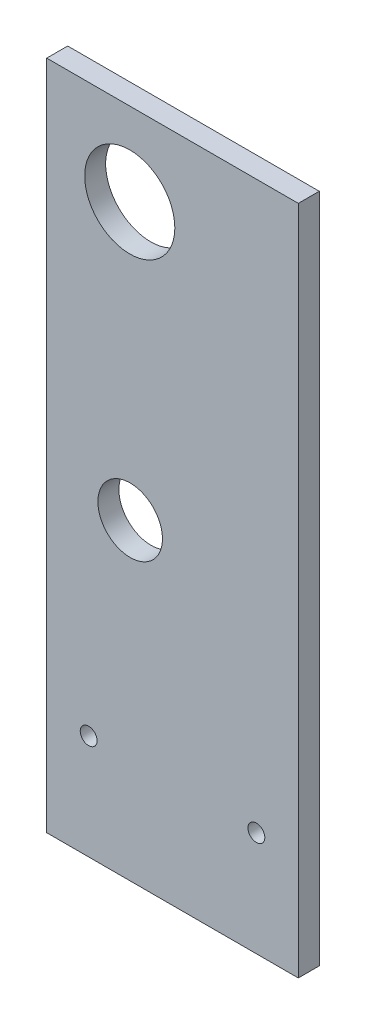
ISO-10303-21;
HEADER;
FILE_DESCRIPTION(('STEP AP214'),'2;1');
FILE_NAME('part.step','',(''),(''),'','','');
FILE_SCHEMA(('AUTOMOTIVE_DESIGN { 1 0 10303 214 1 1 1 1 }'));
ENDSEC;
DATA;
#1=APPLICATION_CONTEXT('core data for automotive mechanical design processes');
#2=APPLICATION_PROTOCOL_DEFINITION('international standard','automotive_design',2000,#1);
#3=PRODUCT_CONTEXT('',#1,'mechanical');
#4=PRODUCT('Part','Part','',(#3));
#5=PRODUCT_RELATED_PRODUCT_CATEGORY('part','',(#4));
#6=PRODUCT_DEFINITION_FORMATION('','',#4);
#7=PRODUCT_DEFINITION_CONTEXT('part definition',#1,'design');
#8=PRODUCT_DEFINITION('design','',#6,#7);
#9=PRODUCT_DEFINITION_SHAPE('','',#8);
#10=(LENGTH_UNIT() NAMED_UNIT(*) SI_UNIT(.MILLI.,.METRE.));
#11=(NAMED_UNIT(*) PLANE_ANGLE_UNIT() SI_UNIT($,.RADIAN.));
#12=(NAMED_UNIT(*) SI_UNIT($,.STERADIAN.) SOLID_ANGLE_UNIT());
#13=UNCERTAINTY_MEASURE_WITH_UNIT(LENGTH_MEASURE(1.E-05),#10,'distance_accuracy_value','');
#14=(GEOMETRIC_REPRESENTATION_CONTEXT(3) GLOBAL_UNCERTAINTY_ASSIGNED_CONTEXT((#13)) GLOBAL_UNIT_ASSIGNED_CONTEXT((#10,
#11,#12)) REPRESENTATION_CONTEXT('',''));
#15=CARTESIAN_POINT('',(0.,0.,0.));
#16=DIRECTION('',(0.,0.,1.));
#17=DIRECTION('',(1.,0.,0.));
#18=AXIS2_PLACEMENT_3D('',#15,#16,#17);
#19=CARTESIAN_POINT('',(-62.9053069719043,37.9942767950052,6.35));
#20=DIRECTION('',(1.,0.,0.));
#21=DIRECTION('',(0.,1.,0.));
#22=AXIS2_PLACEMENT_3D('',#19,#20,#21);
#23=PLANE('',#22);
#24=DIRECTION('',(0.,-1.,0.));
#25=VECTOR('',#24,1.);
#26=CARTESIAN_POINT('',(-62.9053069719043,37.9942767950052,0.));
#27=LINE('',#26,#25);
#28=CARTESIAN_POINT('',(-62.9053069719043,37.9942767950052,0.));
#29=VERTEX_POINT('',#28);
#30=CARTESIAN_POINT('',(-62.9053069719042,-165.205723204995,0.));
#31=VERTEX_POINT('',#30);
#32=EDGE_CURVE('E110',#29,#31,#27,.T.);
#33=ORIENTED_EDGE('',*,*,#32,.T.);
#34=DIRECTION('',(0.,0.,-1.));
#35=VECTOR('',#34,1.);
#36=CARTESIAN_POINT('',(-62.9053069719042,-165.205723204995,6.35));
#37=LINE('',#36,#35);
#38=CARTESIAN_POINT('',(-62.9053069719042,-165.205723204995,6.35));
#39=VERTEX_POINT('',#38);
#40=EDGE_CURVE('E11',#39,#31,#37,.T.);
#41=ORIENTED_EDGE('',*,*,#40,.F.);
#42=DIRECTION('',(0.,-1.,0.));
#43=VECTOR('',#42,1.);
#44=CARTESIAN_POINT('',(-62.9053069719043,37.9942767950052,6.35));
#45=LINE('',#44,#43);
#46=CARTESIAN_POINT('',(-62.9053069719043,37.9942767950052,6.35));
#47=VERTEX_POINT('',#46);
#48=EDGE_CURVE('E94',#47,#39,#45,.T.);
#49=ORIENTED_EDGE('',*,*,#48,.F.);
#50=DIRECTION('',(0.,0.,-1.));
#51=VECTOR('',#50,1.);
#52=CARTESIAN_POINT('',(-62.9053069719043,37.9942767950052,6.35));
#53=LINE('',#52,#51);
#54=EDGE_CURVE('E106',#47,#29,#53,.T.);
#55=ORIENTED_EDGE('',*,*,#54,.T.);
#56=EDGE_LOOP('',(#33,#41,#49,#55));
#57=FACE_BOUND('',#56,.T.);
#58=ADVANCED_FACE('F42',(#57),#23,.F.);
#59=CARTESIAN_POINT('',(-62.9053069719042,-165.205723204995,6.35));
#60=DIRECTION('',(0.,1.,0.));
#61=DIRECTION('',(0.,0.,1.));
#62=AXIS2_PLACEMENT_3D('',#59,#60,#61);
#63=PLANE('',#62);
#64=DIRECTION('',(1.,0.,0.));
#65=VECTOR('',#64,1.);
#66=CARTESIAN_POINT('',(-62.9053069719042,-165.205723204995,0.));
#67=LINE('',#66,#65);
#68=CARTESIAN_POINT('',(13.2946930280958,-165.205723204995,0.));
#69=VERTEX_POINT('',#68);
#70=EDGE_CURVE('E99',#31,#69,#67,.T.);
#71=ORIENTED_EDGE('',*,*,#70,.T.);
#72=DIRECTION('',(0.,0.,-1.));
#73=VECTOR('',#72,1.);
#74=CARTESIAN_POINT('',(13.2946930280958,-165.205723204995,6.35));
#75=LINE('',#74,#73);
#76=CARTESIAN_POINT('',(13.2946930280958,-165.205723204995,6.35));
#77=VERTEX_POINT('',#76);
#78=EDGE_CURVE('E51',#77,#69,#75,.T.);
#79=ORIENTED_EDGE('',*,*,#78,.F.);
#80=DIRECTION('',(1.,0.,0.));
#81=VECTOR('',#80,1.);
#82=CARTESIAN_POINT('',(-62.9053069719042,-165.205723204995,6.35));
#83=LINE('',#82,#81);
#84=EDGE_CURVE('E89',#39,#77,#83,.T.);
#85=ORIENTED_EDGE('',*,*,#84,.F.);
#86=ORIENTED_EDGE('',*,*,#40,.T.);
#87=EDGE_LOOP('',(#71,#79,#85,#86));
#88=FACE_BOUND('',#87,.T.);
#89=ADVANCED_FACE('F98',(#88),#63,.F.);
#90=CARTESIAN_POINT('',(13.2946930280957,37.9942767950052,6.35));
#91=DIRECTION('',(-1.,0.,0.));
#92=DIRECTION('',(0.,-1.,0.));
#93=AXIS2_PLACEMENT_3D('',#90,#91,#92);
#94=PLANE('',#93);
#95=DIRECTION('',(0.,1.,0.));
#96=VECTOR('',#95,1.);
#97=CARTESIAN_POINT('',(13.2946930280957,37.9942767950052,0.));
#98=LINE('',#97,#96);
#99=CARTESIAN_POINT('',(13.2946930280957,37.9942767950052,0.));
#100=VERTEX_POINT('',#99);
#101=EDGE_CURVE('E76',#69,#100,#98,.T.);
#102=ORIENTED_EDGE('',*,*,#101,.T.);
#103=DIRECTION('',(0.,0.,-1.));
#104=VECTOR('',#103,1.);
#105=CARTESIAN_POINT('',(13.2946930280957,37.9942767950052,6.35));
#106=LINE('',#105,#104);
#107=CARTESIAN_POINT('',(13.2946930280957,37.9942767950052,6.35));
#108=VERTEX_POINT('',#107);
#109=EDGE_CURVE('E101',#108,#100,#106,.T.);
#110=ORIENTED_EDGE('',*,*,#109,.F.);
#111=DIRECTION('',(0.,1.,0.));
#112=VECTOR('',#111,1.);
#113=CARTESIAN_POINT('',(13.2946930280957,37.9942767950052,6.35));
#114=LINE('',#113,#112);
#115=EDGE_CURVE('E92',#77,#108,#114,.T.);
#116=ORIENTED_EDGE('',*,*,#115,.F.);
#117=ORIENTED_EDGE('',*,*,#78,.T.);
#118=EDGE_LOOP('',(#102,#110,#116,#117));
#119=FACE_BOUND('',#118,.T.);
#120=ADVANCED_FACE('F102',(#119),#94,.F.);
#121=CARTESIAN_POINT('',(-62.9053069719043,37.9942767950052,6.35));
#122=DIRECTION('',(0.,-1.,0.));
#123=DIRECTION('',(0.,0.,-1.));
#124=AXIS2_PLACEMENT_3D('',#121,#122,#123);
#125=PLANE('',#124);
#126=DIRECTION('',(-1.,0.,0.));
#127=VECTOR('',#126,1.);
#128=CARTESIAN_POINT('',(-62.9053069719043,37.9942767950052,0.));
#129=LINE('',#128,#127);
#130=EDGE_CURVE('E82',#100,#29,#129,.T.);
#131=ORIENTED_EDGE('',*,*,#130,.T.);
#132=ORIENTED_EDGE('',*,*,#54,.F.);
#133=DIRECTION('',(-1.,0.,0.));
#134=VECTOR('',#133,1.);
#135=CARTESIAN_POINT('',(-62.9053069719043,37.9942767950052,6.35));
#136=LINE('',#135,#134);
#137=EDGE_CURVE('E59',#108,#47,#136,.T.);
#138=ORIENTED_EDGE('',*,*,#137,.F.);
#139=ORIENTED_EDGE('',*,*,#109,.T.);
#140=EDGE_LOOP('',(#131,#132,#138,#139));
#141=FACE_BOUND('',#140,.T.);
#142=ADVANCED_FACE('F124',(#141),#125,.F.);
#143=CARTESIAN_POINT('',(0.,0.,6.35));
#144=DIRECTION('',(0.,0.,1.));
#145=DIRECTION('',(1.,0.,0.));
#146=AXIS2_PLACEMENT_3D('',#143,#144,#145);
#147=PLANE('',#146);
#148=CARTESIAN_POINT('',(-37.7593069719043,12.8482767950053,6.35));
#149=DIRECTION('',(0.,0.,1.));
#150=DIRECTION('',(1.,0.,0.));
#151=AXIS2_PLACEMENT_3D('',#148,#149,#150);
#152=CIRCLE('',#151,13.6525);
#153=CARTESIAN_POINT('',(-24.1068069719043,12.8482767950053,6.35));
#154=VERTEX_POINT('',#153);
#155=EDGE_CURVE('E158',#154,#154,#152,.T.);
#156=ORIENTED_EDGE('',*,*,#155,.F.);
#157=EDGE_LOOP('',(#156));
#158=FACE_BOUND('',#157,.T.);
#159=CARTESIAN_POINT('',(-37.6323069719042,-70.5907232049947,6.34999999999999));
#160=DIRECTION('',(0.,0.,1.));
#161=DIRECTION('',(1.,0.,0.));
#162=AXIS2_PLACEMENT_3D('',#159,#160,#161);
#163=CIRCLE('',#162,9.77899999999999);
#164=CARTESIAN_POINT('',(-27.8533069719043,-70.5907232049947,6.34999999999999));
#165=VERTEX_POINT('',#164);
#166=EDGE_CURVE('E145',#165,#165,#163,.T.);
#167=ORIENTED_EDGE('',*,*,#166,.F.);
#168=EDGE_LOOP('',(#167));
#169=FACE_BOUND('',#168,.T.);
#170=CARTESIAN_POINT('',(-50.2053069719042,-133.455723204995,6.34999999999999));
#171=DIRECTION('',(0.,0.,1.));
#172=DIRECTION('',(1.,0.,0.));
#173=AXIS2_PLACEMENT_3D('',#170,#171,#172);
#174=CIRCLE('',#173,2.55270000000001);
#175=CARTESIAN_POINT('',(-47.6526069719042,-133.455723204995,6.34999999999999));
#176=VERTEX_POINT('',#175);
#177=EDGE_CURVE('E135',#176,#176,#174,.T.);
#178=ORIENTED_EDGE('',*,*,#177,.F.);
#179=EDGE_LOOP('',(#178));
#180=FACE_BOUND('',#179,.T.);
#181=CARTESIAN_POINT('',(0.594693028095776,-133.455723204995,6.34999999999999));
#182=DIRECTION('',(0.,0.,1.));
#183=DIRECTION('',(1.,0.,0.));
#184=AXIS2_PLACEMENT_3D('',#181,#182,#183);
#185=CIRCLE('',#184,2.5527);
#186=CARTESIAN_POINT('',(3.14739302809578,-133.455723204995,6.34999999999999));
#187=VERTEX_POINT('',#186);
#188=EDGE_CURVE('E136',#187,#187,#185,.T.);
#189=ORIENTED_EDGE('',*,*,#188,.F.);
#190=EDGE_LOOP('',(#189));
#191=FACE_BOUND('',#190,.T.);
#192=ORIENTED_EDGE('',*,*,#48,.T.);
#193=ORIENTED_EDGE('',*,*,#84,.T.);
#194=ORIENTED_EDGE('',*,*,#115,.T.);
#195=ORIENTED_EDGE('',*,*,#137,.T.);
#196=EDGE_LOOP('',(#192,#193,#194,#195));
#197=FACE_BOUND('',#196,.T.);
#198=ADVANCED_FACE('F90',(#158,#169,#180,#191,#197),#147,.T.);
#199=CARTESIAN_POINT('',(0.,0.,0.));
#200=DIRECTION('',(0.,0.,1.));
#201=DIRECTION('',(1.,0.,0.));
#202=AXIS2_PLACEMENT_3D('',#199,#200,#201);
#203=PLANE('',#202);
#204=CARTESIAN_POINT('',(-37.7593069719043,12.8482767950053,0.));
#205=DIRECTION('',(0.,0.,1.));
#206=DIRECTION('',(1.,0.,0.));
#207=AXIS2_PLACEMENT_3D('',#204,#205,#206);
#208=CIRCLE('',#207,13.6525);
#209=CARTESIAN_POINT('',(-24.1068069719043,12.8482767950053,0.));
#210=VERTEX_POINT('',#209);
#211=EDGE_CURVE('E140',#210,#210,#208,.F.);
#212=ORIENTED_EDGE('',*,*,#211,.F.);
#213=EDGE_LOOP('',(#212));
#214=FACE_BOUND('',#213,.T.);
#215=CARTESIAN_POINT('',(-37.6323069719042,-70.5907232049947,0.));
#216=DIRECTION('',(0.,0.,1.));
#217=DIRECTION('',(1.,0.,0.));
#218=AXIS2_PLACEMENT_3D('',#215,#216,#217);
#219=CIRCLE('',#218,9.77899999999999);
#220=CARTESIAN_POINT('',(-27.8533069719043,-70.5907232049947,0.));
#221=VERTEX_POINT('',#220);
#222=EDGE_CURVE('E114',#221,#221,#219,.F.);
#223=ORIENTED_EDGE('',*,*,#222,.F.);
#224=EDGE_LOOP('',(#223));
#225=FACE_BOUND('',#224,.T.);
#226=CARTESIAN_POINT('',(-50.2053069719042,-133.455723204995,0.));
#227=DIRECTION('',(0.,0.,1.));
#228=DIRECTION('',(1.,0.,0.));
#229=AXIS2_PLACEMENT_3D('',#226,#227,#228);
#230=CIRCLE('',#229,2.55270000000001);
#231=CARTESIAN_POINT('',(-47.6526069719042,-133.455723204995,0.));
#232=VERTEX_POINT('',#231);
#233=EDGE_CURVE('E141',#232,#232,#230,.F.);
#234=ORIENTED_EDGE('',*,*,#233,.F.);
#235=EDGE_LOOP('',(#234));
#236=FACE_BOUND('',#235,.T.);
#237=CARTESIAN_POINT('',(0.594693028095776,-133.455723204995,0.));
#238=DIRECTION('',(0.,0.,1.));
#239=DIRECTION('',(1.,0.,0.));
#240=AXIS2_PLACEMENT_3D('',#237,#238,#239);
#241=CIRCLE('',#240,2.5527);
#242=CARTESIAN_POINT('',(3.14739302809578,-133.455723204995,0.));
#243=VERTEX_POINT('',#242);
#244=EDGE_CURVE('E131',#243,#243,#241,.F.);
#245=ORIENTED_EDGE('',*,*,#244,.F.);
#246=EDGE_LOOP('',(#245));
#247=FACE_BOUND('',#246,.T.);
#248=ORIENTED_EDGE('',*,*,#32,.F.);
#249=ORIENTED_EDGE('',*,*,#130,.F.);
#250=ORIENTED_EDGE('',*,*,#101,.F.);
#251=ORIENTED_EDGE('',*,*,#70,.F.);
#252=EDGE_LOOP('',(#248,#249,#250,#251));
#253=FACE_BOUND('',#252,.T.);
#254=ADVANCED_FACE('F127',(#214,#225,#236,#247,#253),#203,.F.);
#255=CARTESIAN_POINT('',(0.594693028095776,-133.455723204995,-27.659188852893));
#256=DIRECTION('',(0.,0.,1.));
#257=DIRECTION('',(1.,0.,0.));
#258=AXIS2_PLACEMENT_3D('',#255,#256,#257);
#259=CYLINDRICAL_SURFACE('',#258,2.5527);
#260=ORIENTED_EDGE('',*,*,#244,.T.);
#261=EDGE_LOOP('',(#260));
#262=FACE_BOUND('',#261,.T.);
#263=ORIENTED_EDGE('',*,*,#188,.T.);
#264=EDGE_LOOP('',(#263));
#265=FACE_BOUND('',#264,.T.);
#266=ADVANCED_FACE('F174',(#262,#265),#259,.F.);
#267=CARTESIAN_POINT('',(-50.2053069719042,-133.455723204995,-27.659188852893));
#268=DIRECTION('',(0.,0.,1.));
#269=DIRECTION('',(1.,0.,0.));
#270=AXIS2_PLACEMENT_3D('',#267,#268,#269);
#271=CYLINDRICAL_SURFACE('',#270,2.55270000000001);
#272=ORIENTED_EDGE('',*,*,#233,.T.);
#273=EDGE_LOOP('',(#272));
#274=FACE_BOUND('',#273,.T.);
#275=ORIENTED_EDGE('',*,*,#177,.T.);
#276=EDGE_LOOP('',(#275));
#277=FACE_BOUND('',#276,.T.);
#278=ADVANCED_FACE('F176',(#274,#277),#271,.F.);
#279=CARTESIAN_POINT('',(-37.6323069719042,-70.5907232049947,-27.659188852893));
#280=DIRECTION('',(0.,0.,1.));
#281=DIRECTION('',(1.,0.,0.));
#282=AXIS2_PLACEMENT_3D('',#279,#280,#281);
#283=CYLINDRICAL_SURFACE('',#282,9.77899999999999);
#284=ORIENTED_EDGE('',*,*,#222,.T.);
#285=EDGE_LOOP('',(#284));
#286=FACE_BOUND('',#285,.T.);
#287=ORIENTED_EDGE('',*,*,#166,.T.);
#288=EDGE_LOOP('',(#287));
#289=FACE_BOUND('',#288,.T.);
#290=ADVANCED_FACE('F183',(#286,#289),#283,.F.);
#291=CARTESIAN_POINT('',(-37.7593069719043,12.8482767950053,-38.6151013205974));
#292=DIRECTION('',(0.,0.,1.));
#293=DIRECTION('',(1.,0.,0.));
#294=AXIS2_PLACEMENT_3D('',#291,#292,#293);
#295=CYLINDRICAL_SURFACE('',#294,13.6525);
#296=ORIENTED_EDGE('',*,*,#211,.T.);
#297=EDGE_LOOP('',(#296));
#298=FACE_BOUND('',#297,.T.);
#299=ORIENTED_EDGE('',*,*,#155,.T.);
#300=EDGE_LOOP('',(#299));
#301=FACE_BOUND('',#300,.T.);
#302=ADVANCED_FACE('F163',(#298,#301),#295,.F.);
#303=CLOSED_SHELL('',(#58,#89,#120,#142,#198,#254,#266,#278,#290,#302));
#304=MANIFOLD_SOLID_BREP('B2',#303);
#305=ADVANCED_BREP_SHAPE_REPRESENTATION('',(#18,#304),#14);
#306=SHAPE_DEFINITION_REPRESENTATION(#9,#305);
ENDSEC;
END-ISO-10303-21;
